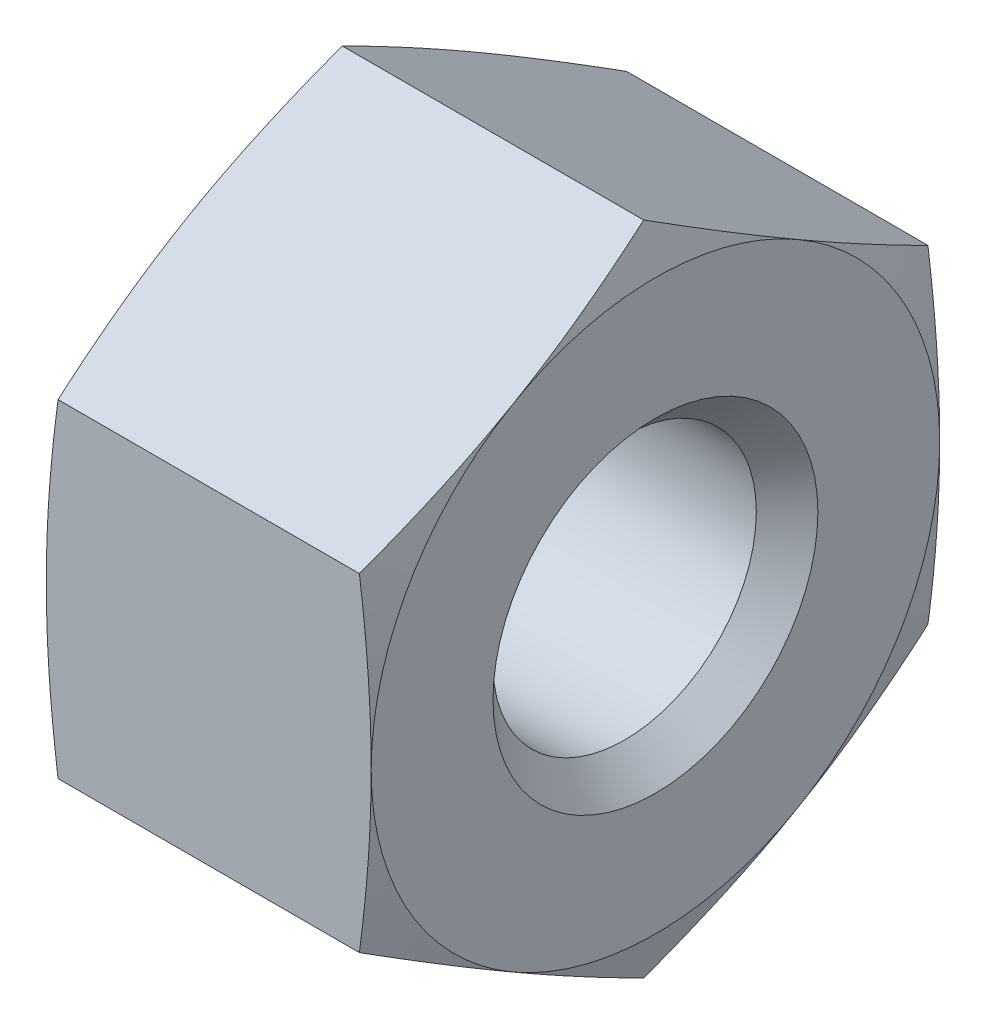
ISO-10303-21;
HEADER;
FILE_DESCRIPTION(('STEP AP214'),'2;1');
FILE_NAME('part.step','',(''),(''),'','','');
FILE_SCHEMA(('AUTOMOTIVE_DESIGN { 1 0 10303 214 1 1 1 1 }'));
ENDSEC;
DATA;
#1=APPLICATION_CONTEXT('core data for automotive mechanical design processes');
#2=APPLICATION_PROTOCOL_DEFINITION('international standard','automotive_design',2000,#1);
#3=PRODUCT_CONTEXT('',#1,'mechanical');
#4=PRODUCT('Part','Part','',(#3));
#5=PRODUCT_RELATED_PRODUCT_CATEGORY('part','',(#4));
#6=PRODUCT_DEFINITION_FORMATION('','',#4);
#7=PRODUCT_DEFINITION_CONTEXT('part definition',#1,'design');
#8=PRODUCT_DEFINITION('design','',#6,#7);
#9=PRODUCT_DEFINITION_SHAPE('','',#8);
#10=(LENGTH_UNIT() NAMED_UNIT(*) SI_UNIT(.MILLI.,.METRE.));
#11=(NAMED_UNIT(*) PLANE_ANGLE_UNIT() SI_UNIT($,.RADIAN.));
#12=(NAMED_UNIT(*) SI_UNIT($,.STERADIAN.) SOLID_ANGLE_UNIT());
#13=UNCERTAINTY_MEASURE_WITH_UNIT(LENGTH_MEASURE(1.E-05),#10,'distance_accuracy_value','');
#14=(GEOMETRIC_REPRESENTATION_CONTEXT(3) GLOBAL_UNCERTAINTY_ASSIGNED_CONTEXT((#13)) GLOBAL_UNIT_ASSIGNED_CONTEXT((#10,
#11,#12)) REPRESENTATION_CONTEXT('',''));
#15=CARTESIAN_POINT('',(0.,0.,0.));
#16=DIRECTION('',(0.,0.,1.));
#17=DIRECTION('',(1.,0.,0.));
#18=AXIS2_PLACEMENT_3D('',#15,#16,#17);
#19=CARTESIAN_POINT('',(4.,2.75,0.));
#20=DIRECTION('',(1.,0.,0.));
#21=DIRECTION('',(0.,0.,-1.));
#22=AXIS2_PLACEMENT_3D('',#19,#20,#21);
#23=PLANE('',#22);
#24=CARTESIAN_POINT('',(3.99999999996226,0.,0.));
#25=DIRECTION('',(1.,0.,0.));
#26=DIRECTION('',(0.,0.,-1.));
#27=AXIS2_PLACEMENT_3D('',#24,#25,#26);
#28=CIRCLE('',#27,2.00000000000955);
#29=CARTESIAN_POINT('',(3.99999999996226,0.,-2.00000000000955));
#30=VERTEX_POINT('',#29);
#31=EDGE_CURVE('E167',#30,#30,#28,.F.);
#32=ORIENTED_EDGE('',*,*,#31,.T.);
#33=EDGE_LOOP('',(#32));
#34=FACE_BOUND('',#33,.T.);
#35=CARTESIAN_POINT('',(3.99999999999999,0.,0.));
#36=DIRECTION('',(-1.,0.,0.));
#37=DIRECTION('',(0.,-1.,0.));
#38=AXIS2_PLACEMENT_3D('',#35,#36,#37);
#39=CIRCLE('',#38,3.5);
#40=CARTESIAN_POINT('',(3.99999999999999,0.,-3.5));
#41=VERTEX_POINT('',#40);
#42=CARTESIAN_POINT('',(3.99999999999999,-3.03108891324554,-1.75));
#43=VERTEX_POINT('',#42);
#44=EDGE_CURVE('E104',#41,#43,#39,.T.);
#45=ORIENTED_EDGE('',*,*,#44,.F.);
#46=CARTESIAN_POINT('',(3.99999999999999,0.,0.));
#47=DIRECTION('',(-1.,0.,0.));
#48=DIRECTION('',(0.,-1.,0.));
#49=AXIS2_PLACEMENT_3D('',#46,#47,#48);
#50=CIRCLE('',#49,3.49999999999999);
#51=CARTESIAN_POINT('',(3.99999999999999,3.03108891324553,-1.75));
#52=VERTEX_POINT('',#51);
#53=EDGE_CURVE('E18',#52,#41,#50,.T.);
#54=ORIENTED_EDGE('',*,*,#53,.F.);
#55=CARTESIAN_POINT('',(3.99999999999999,0.,0.));
#56=DIRECTION('',(-1.,0.,0.));
#57=DIRECTION('',(0.,-1.,0.));
#58=AXIS2_PLACEMENT_3D('',#55,#56,#57);
#59=CIRCLE('',#58,3.49999999999999);
#60=CARTESIAN_POINT('',(3.99999999999999,3.03108891324553,1.75));
#61=VERTEX_POINT('',#60);
#62=EDGE_CURVE('E454',#61,#52,#59,.T.);
#63=ORIENTED_EDGE('',*,*,#62,.F.);
#64=CARTESIAN_POINT('',(3.99999999999999,0.,0.));
#65=DIRECTION('',(-1.,0.,0.));
#66=DIRECTION('',(0.,-1.,0.));
#67=AXIS2_PLACEMENT_3D('',#64,#65,#66);
#68=CIRCLE('',#67,3.5);
#69=CARTESIAN_POINT('',(3.99999999999999,0.,3.5));
#70=VERTEX_POINT('',#69);
#71=EDGE_CURVE('E458',#70,#61,#68,.T.);
#72=ORIENTED_EDGE('',*,*,#71,.F.);
#73=CARTESIAN_POINT('',(3.99999999999999,0.,0.));
#74=DIRECTION('',(-1.,0.,0.));
#75=DIRECTION('',(0.,-1.,0.));
#76=AXIS2_PLACEMENT_3D('',#73,#74,#75);
#77=CIRCLE('',#76,3.5);
#78=CARTESIAN_POINT('',(3.99999999999999,-3.03108891324554,1.75));
#79=VERTEX_POINT('',#78);
#80=EDGE_CURVE('E448',#79,#70,#77,.T.);
#81=ORIENTED_EDGE('',*,*,#80,.F.);
#82=CARTESIAN_POINT('',(3.99999999999999,0.,0.));
#83=DIRECTION('',(-1.,0.,0.));
#84=DIRECTION('',(0.,-1.,0.));
#85=AXIS2_PLACEMENT_3D('',#82,#83,#84);
#86=CIRCLE('',#85,3.5);
#87=EDGE_CURVE('E107',#43,#79,#86,.T.);
#88=ORIENTED_EDGE('',*,*,#87,.F.);
#89=EDGE_LOOP('',(#45,#54,#63,#72,#81,#88));
#90=FACE_BOUND('',#89,.T.);
#91=ADVANCED_FACE('F15',(#34,#90),#23,.T.);
#92=CARTESIAN_POINT('',(3.85404791528328,0.,0.));
#93=DIRECTION('',(-1.,0.,0.));
#94=DIRECTION('',(0.,-1.,0.));
#95=AXIS2_PLACEMENT_3D('',#92,#93,#94);
#96=CONICAL_SURFACE('',#95,4.04470059563334,1.30899693899575);
#97=CARTESIAN_POINT('',(3.85491840485416,2.02072594216369,-3.5));
#98=CARTESIAN_POINT('',(3.87736917683996,2.10448512383601,-3.35492484174316));
#99=CARTESIAN_POINT('',(3.89775556926771,2.18839464686139,-3.20958928462431));
#100=CARTESIAN_POINT('',(3.93355670405657,2.35637986696115,-2.9186303484909));
#101=CARTESIAN_POINT('',(3.94897707691382,2.44045526632385,-2.77300748512805));
#102=CARTESIAN_POINT('',(3.97406106263086,2.60884836453657,-2.48134208337968));
#103=CARTESIAN_POINT('',(3.98372331729823,2.69316611584225,-2.3352994541383));
#104=CARTESIAN_POINT('',(3.99345415347838,2.81977878595144,-2.11599987662721));
#105=CARTESIAN_POINT('',(3.99590404464308,2.86203034378168,-2.04281803176631));
#106=CARTESIAN_POINT('',(3.99917891629725,2.94655050834606,-1.89642481247673));
#107=CARTESIAN_POINT('',(4.00000384450534,2.98881911558498,-1.82321343717374));
#108=CARTESIAN_POINT('',(3.99999999999999,3.03108891324553,-1.75));
#109=B_SPLINE_CURVE_WITH_KNOTS('',3,(#97,#98,#99,#100,#101,#102,#103,#104,#105,#106,#107,#108),
.UNSPECIFIED.,.F.,.F.,(4,2,2,2,2,4),(0.,0.5070702590149,1.01356355859227,1.52017627971381,
1.77377837155654,2.02738862263201),.UNSPECIFIED.);
#110=CARTESIAN_POINT('',(3.85491840485416,2.02072594216369,-3.5));
#111=VERTEX_POINT('',#110);
#112=EDGE_CURVE('E126',#111,#52,#109,.T.);
#113=ORIENTED_EDGE('',*,*,#112,.T.);
#114=ORIENTED_EDGE('',*,*,#53,.T.);
#115=CARTESIAN_POINT('',(3.99999999999999,0.,-3.5));
#116=CARTESIAN_POINT('',(4.00000384450534,0.0845395953211098,-3.5));
#117=CARTESIAN_POINT('',(3.99917891629725,0.169076809798954,-3.5));
#118=CARTESIAN_POINT('',(3.99590404464308,0.338117138927704,-3.5));
#119=CARTESIAN_POINT('',(3.99345415347838,0.422620254588179,-3.5));
#120=CARTESIAN_POINT('',(3.98372331729823,0.675845594806578,-3.5));
#121=CARTESIAN_POINT('',(3.97406106263086,0.844481097417921,-3.5));
#122=CARTESIAN_POINT('',(3.94897707691382,1.18126729384336,-3.5));
#123=CARTESIAN_POINT('',(3.93355670405657,1.34941809256878,-3.5));
#124=CARTESIAN_POINT('',(3.89775556926771,1.68538853276828,-3.5));
#125=CARTESIAN_POINT('',(3.87736917683996,1.85320757881906,-3.5));
#126=CARTESIAN_POINT('',(3.85491840485416,2.02072594216369,-3.5));
#127=B_SPLINE_CURVE_WITH_KNOTS('',3,(#115,#116,#117,#118,#119,#120,#121,#122,#123,#124,#125,
#126),.UNSPECIFIED.,.F.,.F.,(4,2,2,2,2,4),(0.,0.253610251075474,0.507212342918203,
1.01382506403975,1.52031836361711,2.02738862263201),.UNSPECIFIED.);
#128=EDGE_CURVE('E120',#41,#111,#127,.T.);
#129=ORIENTED_EDGE('',*,*,#128,.T.);
#130=EDGE_LOOP('',(#113,#114,#129));
#131=FACE_BOUND('',#130,.T.);
#132=ADVANCED_FACE('F124',(#131),#96,.T.);
#133=CARTESIAN_POINT('',(3.85404791528328,0.,0.));
#134=DIRECTION('',(-1.,0.,0.));
#135=DIRECTION('',(0.,-1.,0.));
#136=AXIS2_PLACEMENT_3D('',#133,#134,#135);
#137=CONICAL_SURFACE('',#136,4.04470059563334,1.30899693899575);
#138=ORIENTED_EDGE('',*,*,#44,.T.);
#139=CARTESIAN_POINT('',(3.99999999999999,-3.03108891324554,-1.75));
#140=CARTESIAN_POINT('',(4.00000384450534,-2.98881911558498,-1.82321343717374));
#141=CARTESIAN_POINT('',(3.99917891629725,-2.94655050834606,-1.89642481247672));
#142=CARTESIAN_POINT('',(3.99590404464308,-2.86203034378168,-2.0428180317663));
#143=CARTESIAN_POINT('',(3.99345415347838,-2.81977878595145,-2.11599987662721));
#144=CARTESIAN_POINT('',(3.98372331729823,-2.69316611584225,-2.3352994541383));
#145=CARTESIAN_POINT('',(3.97406106263086,-2.60884836453657,-2.48134208337968));
#146=CARTESIAN_POINT('',(3.94897707691382,-2.44045526632385,-2.77300748512805));
#147=CARTESIAN_POINT('',(3.93355670405657,-2.35637986696115,-2.9186303484909));
#148=CARTESIAN_POINT('',(3.89775556926771,-2.18839464686139,-3.20958928462431));
#149=CARTESIAN_POINT('',(3.87736917683996,-2.10448512383601,-3.35492484174316));
#150=CARTESIAN_POINT('',(3.85491840485416,-2.02072594216369,-3.5));
#151=B_SPLINE_CURVE_WITH_KNOTS('',3,(#139,#140,#141,#142,#143,#144,#145,#146,#147,#148,#149,
#150),.UNSPECIFIED.,.F.,.F.,(4,2,2,2,2,4),(0.,0.253610251075475,0.507212342918203,
1.01382506403975,1.52031836361711,2.02738862263202),.UNSPECIFIED.);
#152=CARTESIAN_POINT('',(3.85491840485416,-2.02072594216369,-3.5));
#153=VERTEX_POINT('',#152);
#154=EDGE_CURVE('E115',#43,#153,#151,.T.);
#155=ORIENTED_EDGE('',*,*,#154,.T.);
#156=CARTESIAN_POINT('',(3.85491840485416,-2.02072594216369,-3.5));
#157=CARTESIAN_POINT('',(3.87736917683996,-1.85320757881906,-3.5));
#158=CARTESIAN_POINT('',(3.89775556926771,-1.68538853276828,-3.5));
#159=CARTESIAN_POINT('',(3.93355670405657,-1.34941809256878,-3.5));
#160=CARTESIAN_POINT('',(3.94897707691382,-1.18126729384336,-3.5));
#161=CARTESIAN_POINT('',(3.97406106263086,-0.84448109741792,-3.5));
#162=CARTESIAN_POINT('',(3.98372331729823,-0.675845594806578,-3.5));
#163=CARTESIAN_POINT('',(3.99345415347838,-0.422620254588179,-3.5));
#164=CARTESIAN_POINT('',(3.99590404464308,-0.338117138927704,-3.5));
#165=CARTESIAN_POINT('',(3.99917891629725,-0.169076809798954,-3.5));
#166=CARTESIAN_POINT('',(4.00000384450534,-0.0845395953211098,-3.5));
#167=CARTESIAN_POINT('',(3.99999999999999,0.,-3.5));
#168=B_SPLINE_CURVE_WITH_KNOTS('',3,(#156,#157,#158,#159,#160,#161,#162,#163,#164,#165,#166,
#167),.UNSPECIFIED.,.F.,.F.,(4,2,2,2,2,4),(0.,0.507070259014901,1.01356355859227,
1.52017627971381,1.77377837155654,2.02738862263201),.UNSPECIFIED.);
#169=EDGE_CURVE('E113',#153,#41,#168,.T.);
#170=ORIENTED_EDGE('',*,*,#169,.T.);
#171=EDGE_LOOP('',(#138,#155,#170));
#172=FACE_BOUND('',#171,.T.);
#173=ADVANCED_FACE('F114',(#172),#137,.T.);
#174=CARTESIAN_POINT('',(3.85404791528328,0.,0.));
#175=DIRECTION('',(-1.,0.,0.));
#176=DIRECTION('',(0.,-1.,0.));
#177=AXIS2_PLACEMENT_3D('',#174,#175,#176);
#178=CONICAL_SURFACE('',#177,4.04470059563334,1.30899693899575);
#179=ORIENTED_EDGE('',*,*,#87,.T.);
#180=CARTESIAN_POINT('',(3.99999999999999,-3.03108891324554,1.75));
#181=CARTESIAN_POINT('',(4.00000384450534,-3.07335871090609,1.67678656282626));
#182=CARTESIAN_POINT('',(3.99917891629725,-3.11562731814501,1.60357518752327));
#183=CARTESIAN_POINT('',(3.99590404464308,-3.20014748270939,1.45718196823369));
#184=CARTESIAN_POINT('',(3.99345415347838,-3.24239904053963,1.38400012337279));
#185=CARTESIAN_POINT('',(3.98372331729823,-3.36901171064883,1.1647005458617));
#186=CARTESIAN_POINT('',(3.97406106263086,-3.4533294619545,1.01865791662032));
#187=CARTESIAN_POINT('',(3.94897707691382,-3.62172256016722,0.72699251487195));
#188=CARTESIAN_POINT('',(3.93355670405657,-3.70579795952992,0.581369651509097));
#189=CARTESIAN_POINT('',(3.89775556926771,-3.87378317962968,0.290410715375687));
#190=CARTESIAN_POINT('',(3.87736917683996,-3.95769270265506,0.145075158256844));
#191=CARTESIAN_POINT('',(3.85491840485416,-4.04145188432738,0.));
#192=B_SPLINE_CURVE_WITH_KNOTS('',3,(#180,#181,#182,#183,#184,#185,#186,#187,#188,#189,#190,
#191),.UNSPECIFIED.,.F.,.F.,(4,2,2,2,2,4),(0.,0.253610251075474,0.507212342918202,
1.01382506403974,1.52031836361711,2.02738862263201),.UNSPECIFIED.);
#193=CARTESIAN_POINT('',(3.85491840485416,-4.04145188432738,0.));
#194=VERTEX_POINT('',#193);
#195=EDGE_CURVE('E279',#79,#194,#192,.T.);
#196=ORIENTED_EDGE('',*,*,#195,.T.);
#197=CARTESIAN_POINT('',(3.85491840485416,-4.04145188432738,0.));
#198=CARTESIAN_POINT('',(3.87736917683996,-3.95769270265506,-0.145075158256844));
#199=CARTESIAN_POINT('',(3.89775556926771,-3.87378317962968,-0.290410715375686));
#200=CARTESIAN_POINT('',(3.93355670405657,-3.70579795952992,-0.581369651509097));
#201=CARTESIAN_POINT('',(3.94897707691382,-3.62172256016722,-0.72699251487195));
#202=CARTESIAN_POINT('',(3.97406106263086,-3.4533294619545,-1.01865791662032));
#203=CARTESIAN_POINT('',(3.98372331729823,-3.36901171064882,-1.1647005458617));
#204=CARTESIAN_POINT('',(3.99345415347838,-3.24239904053962,-1.38400012337279));
#205=CARTESIAN_POINT('',(3.99590404464308,-3.20014748270939,-1.45718196823369));
#206=CARTESIAN_POINT('',(3.99917891629725,-3.11562731814501,-1.60357518752327));
#207=CARTESIAN_POINT('',(4.00000384450534,-3.07335871090609,-1.67678656282626));
#208=CARTESIAN_POINT('',(3.99999999999999,-3.03108891324554,-1.75));
#209=B_SPLINE_CURVE_WITH_KNOTS('',3,(#197,#198,#199,#200,#201,#202,#203,#204,#205,#206,#207,
#208),.UNSPECIFIED.,.F.,.F.,(4,2,2,2,2,4),(0.,0.5070702590149,1.01356355859227,1.52017627971381,
1.77377837155654,2.02738862263201),.UNSPECIFIED.);
#210=EDGE_CURVE('E137',#194,#43,#209,.T.);
#211=ORIENTED_EDGE('',*,*,#210,.T.);
#212=EDGE_LOOP('',(#179,#196,#211));
#213=FACE_BOUND('',#212,.T.);
#214=ADVANCED_FACE('F267',(#213),#178,.T.);
#215=CARTESIAN_POINT('',(3.85404791528328,0.,0.));
#216=DIRECTION('',(-1.,0.,0.));
#217=DIRECTION('',(0.,-1.,0.));
#218=AXIS2_PLACEMENT_3D('',#215,#216,#217);
#219=CONICAL_SURFACE('',#218,4.04470059563334,1.30899693899575);
#220=ORIENTED_EDGE('',*,*,#80,.T.);
#221=CARTESIAN_POINT('',(3.99999999999999,0.,3.5));
#222=CARTESIAN_POINT('',(4.00000384450534,-0.0845395953211107,3.5));
#223=CARTESIAN_POINT('',(3.99917891629725,-0.169076809798955,3.5));
#224=CARTESIAN_POINT('',(3.99590404464308,-0.338117138927704,3.5));
#225=CARTESIAN_POINT('',(3.99345415347838,-0.42262025458818,3.5));
#226=CARTESIAN_POINT('',(3.98372331729823,-0.675845594806579,3.5));
#227=CARTESIAN_POINT('',(3.97406106263086,-0.844481097417921,3.5));
#228=CARTESIAN_POINT('',(3.94897707691382,-1.18126729384336,3.5));
#229=CARTESIAN_POINT('',(3.93355670405657,-1.34941809256878,3.5));
#230=CARTESIAN_POINT('',(3.89775556926771,-1.68538853276828,3.5));
#231=CARTESIAN_POINT('',(3.87736917683996,-1.85320757881906,3.5));
#232=CARTESIAN_POINT('',(3.85491840485416,-2.02072594216369,3.5));
#233=B_SPLINE_CURVE_WITH_KNOTS('',3,(#221,#222,#223,#224,#225,#226,#227,#228,#229,#230,#231,
#232),.UNSPECIFIED.,.F.,.F.,(4,2,2,2,2,4),(0.,0.253610251075474,0.507212342918202,
1.01382506403975,1.52031836361711,2.02738862263201),.UNSPECIFIED.);
#234=CARTESIAN_POINT('',(3.85491840485416,-2.02072594216369,3.5));
#235=VERTEX_POINT('',#234);
#236=EDGE_CURVE('E251',#70,#235,#233,.T.);
#237=ORIENTED_EDGE('',*,*,#236,.T.);
#238=CARTESIAN_POINT('',(3.85491840485416,-2.02072594216369,3.5));
#239=CARTESIAN_POINT('',(3.87736917683996,-2.10448512383601,3.35492484174316));
#240=CARTESIAN_POINT('',(3.89775556926771,-2.1883946468614,3.20958928462431));
#241=CARTESIAN_POINT('',(3.93355670405657,-2.35637986696115,2.9186303484909));
#242=CARTESIAN_POINT('',(3.94897707691382,-2.44045526632385,2.77300748512805));
#243=CARTESIAN_POINT('',(3.97406106263086,-2.60884836453658,2.48134208337968));
#244=CARTESIAN_POINT('',(3.98372331729823,-2.69316611584225,2.3352994541383));
#245=CARTESIAN_POINT('',(3.99345415347838,-2.81977878595145,2.11599987662721));
#246=CARTESIAN_POINT('',(3.99590404464308,-2.86203034378168,2.0428180317663));
#247=CARTESIAN_POINT('',(3.99917891629725,-2.94655050834606,1.89642481247672));
#248=CARTESIAN_POINT('',(4.00000384450534,-2.98881911558498,1.82321343717374));
#249=CARTESIAN_POINT('',(3.99999999999999,-3.03108891324554,1.75));
#250=B_SPLINE_CURVE_WITH_KNOTS('',3,(#238,#239,#240,#241,#242,#243,#244,#245,#246,#247,#248,
#249),.UNSPECIFIED.,.F.,.F.,(4,2,2,2,2,4),(0.,0.507070259014902,1.01356355859227,
1.52017627971381,1.77377837155654,2.02738862263202),.UNSPECIFIED.);
#251=EDGE_CURVE('E272',#235,#79,#250,.T.);
#252=ORIENTED_EDGE('',*,*,#251,.T.);
#253=EDGE_LOOP('',(#220,#237,#252));
#254=FACE_BOUND('',#253,.T.);
#255=ADVANCED_FACE('F261',(#254),#219,.T.);
#256=CARTESIAN_POINT('',(3.85404791528328,0.,0.));
#257=DIRECTION('',(-1.,0.,0.));
#258=DIRECTION('',(0.,-1.,0.));
#259=AXIS2_PLACEMENT_3D('',#256,#257,#258);
#260=CONICAL_SURFACE('',#259,4.04470059563334,1.30899693899575);
#261=CARTESIAN_POINT('',(3.99999999999999,3.03108891324553,-1.75));
#262=CARTESIAN_POINT('',(4.00000384450534,3.07335871090609,-1.67678656282627));
#263=CARTESIAN_POINT('',(3.99917891629725,3.11562731814501,-1.60357518752328));
#264=CARTESIAN_POINT('',(3.99590404464308,3.20014748270939,-1.4571819682337));
#265=CARTESIAN_POINT('',(3.99345415347838,3.24239904053962,-1.38400012337279));
#266=CARTESIAN_POINT('',(3.98372331729823,3.36901171064882,-1.1647005458617));
#267=CARTESIAN_POINT('',(3.97406106263086,3.4533294619545,-1.01865791662032));
#268=CARTESIAN_POINT('',(3.94897707691382,3.62172256016722,-0.726992514871952));
#269=CARTESIAN_POINT('',(3.93355670405657,3.70579795952992,-0.581369651509099));
#270=CARTESIAN_POINT('',(3.89775556926771,3.87378317962968,-0.290410715375688));
#271=CARTESIAN_POINT('',(3.87736917683996,3.95769270265506,-0.145075158256845));
#272=CARTESIAN_POINT('',(3.85491840485416,4.04145188432738,0.));
#273=B_SPLINE_CURVE_WITH_KNOTS('',3,(#261,#262,#263,#264,#265,#266,#267,#268,#269,#270,#271,
#272),.UNSPECIFIED.,.F.,.F.,(4,2,2,2,2,4),(0.,0.253610251075475,0.507212342918203,
1.01382506403975,1.52031836361711,2.02738862263201),.UNSPECIFIED.);
#274=CARTESIAN_POINT('',(3.85491840485416,4.04145188432738,0.));
#275=VERTEX_POINT('',#274);
#276=EDGE_CURVE('E121',#52,#275,#273,.T.);
#277=ORIENTED_EDGE('',*,*,#276,.T.);
#278=CARTESIAN_POINT('',(3.85491840485416,4.04145188432738,0.));
#279=CARTESIAN_POINT('',(3.87736917683996,3.95769270265506,0.145075158256844));
#280=CARTESIAN_POINT('',(3.89775556926771,3.87378317962967,0.290410715375687));
#281=CARTESIAN_POINT('',(3.93355670405657,3.70579795952992,0.581369651509098));
#282=CARTESIAN_POINT('',(3.94897707691382,3.62172256016721,0.726992514871952));
#283=CARTESIAN_POINT('',(3.97406106263086,3.45332946195449,1.01865791662032));
#284=CARTESIAN_POINT('',(3.98372331729823,3.36901171064882,1.1647005458617));
#285=CARTESIAN_POINT('',(3.99345415347838,3.24239904053962,1.38400012337279));
#286=CARTESIAN_POINT('',(3.99590404464308,3.20014748270939,1.4571819682337));
#287=CARTESIAN_POINT('',(3.99917891629725,3.11562731814501,1.60357518752328));
#288=CARTESIAN_POINT('',(4.00000384450534,3.07335871090609,1.67678656282627));
#289=CARTESIAN_POINT('',(3.99999999999999,3.03108891324553,1.75));
#290=B_SPLINE_CURVE_WITH_KNOTS('',3,(#278,#279,#280,#281,#282,#283,#284,#285,#286,#287,#288,
#289),.UNSPECIFIED.,.F.,.F.,(4,2,2,2,2,4),(0.,0.507070259014902,1.01356355859227,
1.52017627971381,1.77377837155654,2.02738862263202),.UNSPECIFIED.);
#291=EDGE_CURVE('E243',#275,#61,#290,.T.);
#292=ORIENTED_EDGE('',*,*,#291,.T.);
#293=ORIENTED_EDGE('',*,*,#62,.T.);
#294=EDGE_LOOP('',(#277,#292,#293));
#295=FACE_BOUND('',#294,.T.);
#296=ADVANCED_FACE('F257',(#295),#260,.T.);
#297=CARTESIAN_POINT('',(3.85404791528328,0.,0.));
#298=DIRECTION('',(-1.,0.,0.));
#299=DIRECTION('',(0.,-1.,0.));
#300=AXIS2_PLACEMENT_3D('',#297,#298,#299);
#301=CONICAL_SURFACE('',#300,4.04470059563334,1.30899693899575);
#302=CARTESIAN_POINT('',(3.85491840485416,2.02072594216369,3.5));
#303=CARTESIAN_POINT('',(3.87736917683996,1.85320757881906,3.5));
#304=CARTESIAN_POINT('',(3.89775556926771,1.68538853276828,3.5));
#305=CARTESIAN_POINT('',(3.93355670405657,1.34941809256878,3.5));
#306=CARTESIAN_POINT('',(3.94897707691382,1.18126729384336,3.5));
#307=CARTESIAN_POINT('',(3.97406106263086,0.844481097417921,3.5));
#308=CARTESIAN_POINT('',(3.98372331729823,0.675845594806579,3.5));
#309=CARTESIAN_POINT('',(3.99345415347838,0.422620254588179,3.5));
#310=CARTESIAN_POINT('',(3.99590404464308,0.338117138927703,3.5));
#311=CARTESIAN_POINT('',(3.99917891629725,0.169076809798954,3.5));
#312=CARTESIAN_POINT('',(4.00000384450534,0.0845395953211095,3.5));
#313=CARTESIAN_POINT('',(3.99999999999999,0.,3.5));
#314=B_SPLINE_CURVE_WITH_KNOTS('',3,(#302,#303,#304,#305,#306,#307,#308,#309,#310,#311,#312,
#313),.UNSPECIFIED.,.F.,.F.,(4,2,2,2,2,4),(0.,0.507070259014901,1.01356355859227,
1.52017627971381,1.77377837155654,2.02738862263201),.UNSPECIFIED.);
#315=CARTESIAN_POINT('',(3.85491840485416,2.02072594216369,3.5));
#316=VERTEX_POINT('',#315);
#317=EDGE_CURVE('E379',#316,#70,#314,.T.);
#318=ORIENTED_EDGE('',*,*,#317,.T.);
#319=ORIENTED_EDGE('',*,*,#71,.T.);
#320=CARTESIAN_POINT('',(3.99999999999999,3.03108891324553,1.75));
#321=CARTESIAN_POINT('',(4.00000384450534,2.98881911558498,1.82321343717374));
#322=CARTESIAN_POINT('',(3.99917891629725,2.94655050834606,1.89642481247673));
#323=CARTESIAN_POINT('',(3.99590404464308,2.86203034378168,2.04281803176631));
#324=CARTESIAN_POINT('',(3.99345415347838,2.81977878595144,2.11599987662721));
#325=CARTESIAN_POINT('',(3.98372331729823,2.69316611584224,2.3352994541383));
#326=CARTESIAN_POINT('',(3.97406106263086,2.60884836453657,2.48134208337968));
#327=CARTESIAN_POINT('',(3.94897707691382,2.44045526632385,2.77300748512805));
#328=CARTESIAN_POINT('',(3.93355670405657,2.35637986696115,2.9186303484909));
#329=CARTESIAN_POINT('',(3.89775556926771,2.18839464686139,3.20958928462431));
#330=CARTESIAN_POINT('',(3.87736917683996,2.10448512383601,3.35492484174316));
#331=CARTESIAN_POINT('',(3.85491840485416,2.02072594216369,3.5));
#332=B_SPLINE_CURVE_WITH_KNOTS('',3,(#320,#321,#322,#323,#324,#325,#326,#327,#328,#329,#330,
#331),.UNSPECIFIED.,.F.,.F.,(4,2,2,2,2,4),(0.,0.253610251075474,0.507212342918202,
1.01382506403974,1.52031836361711,2.02738862263201),.UNSPECIFIED.);
#333=EDGE_CURVE('E207',#61,#316,#332,.T.);
#334=ORIENTED_EDGE('',*,*,#333,.T.);
#335=EDGE_LOOP('',(#318,#319,#334));
#336=FACE_BOUND('',#335,.T.);
#337=ADVANCED_FACE('F260',(#336),#301,.T.);
#338=CARTESIAN_POINT('',(4.0000000000191,0.,0.));
#339=DIRECTION('',(1.,0.,0.));
#340=DIRECTION('',(0.,0.,-1.));
#341=AXIS2_PLACEMENT_3D('',#338,#339,#340);
#342=CONICAL_SURFACE('',#341,2.00000000006639,0.785398163397448);
#343=CARTESIAN_POINT('',(3.621,0.,0.));
#344=DIRECTION('',(1.,0.,0.));
#345=DIRECTION('',(0.,1.,0.));
#346=AXIS2_PLACEMENT_3D('',#343,#344,#345);
#347=CIRCLE('',#346,1.621);
#348=CARTESIAN_POINT('',(3.621,1.621,0.));
#349=VERTEX_POINT('',#348);
#350=EDGE_CURVE('E202',#349,#349,#347,.F.);
#351=ORIENTED_EDGE('',*,*,#350,.T.);
#352=EDGE_LOOP('',(#351));
#353=FACE_BOUND('',#352,.T.);
#354=ORIENTED_EDGE('',*,*,#31,.F.);
#355=EDGE_LOOP('',(#354));
#356=FACE_BOUND('',#355,.T.);
#357=ADVANCED_FACE('F177',(#353,#356),#342,.F.);
#358=CARTESIAN_POINT('',(5.,4.04145188432738,0.));
#359=DIRECTION('',(0.,-0.866025403784439,0.5));
#360=DIRECTION('',(0.,-0.5,-0.866025403784439));
#361=AXIS2_PLACEMENT_3D('',#358,#359,#360);
#362=PLANE('',#361);
#363=CARTESIAN_POINT('',(0.145081608245902,4.04145185238628,-1.34823072870567E-08));
#364=CARTESIAN_POINT('',(0.122630826132476,3.95769268398321,-0.145075175601402));
#365=CARTESIAN_POINT('',(0.102244429817869,3.87378316698493,-0.290410733266092));
#366=CARTESIAN_POINT('',(0.0664432926892216,3.70579795260836,-0.58136966750397));
#367=CARTESIAN_POINT('',(0.0510229213706809,3.6217225529491,-0.726992528428568));
#368=CARTESIAN_POINT('',(0.0259389371152439,3.45332945595195,-1.01865792596233));
#369=CARTESIAN_POINT('',(0.0162766823657995,3.36901170615899,-1.16470055342723));
#370=CARTESIAN_POINT('',(0.00654584631208415,3.24239903787159,-1.38400012809963));
#371=CARTESIAN_POINT('',(0.00409595523122862,3.20014748056529,-1.45718197200021));
#372=CARTESIAN_POINT('',(0.000821083702638755,3.11562731704075,-1.60357518938307));
#373=CARTESIAN_POINT('',(-3.84446338335835E-06,3.07335871031773,-1.67678656373966));
#374=CARTESIAN_POINT('',(0.,3.03108891324554,-1.75));
#375=B_SPLINE_CURVE_WITH_KNOTS('',3,(#363,#364,#365,#366,#367,#368,#369,#370,#371,#372,#373,
#374),.UNSPECIFIED.,.F.,.F.,(4,2,2,2,2,4),(0.,0.507070252846175,1.01356354603767,
1.52017626036794,1.77377834891865,2.02738859675396),.UNSPECIFIED.);
#376=CARTESIAN_POINT('',(0.145081593442021,4.04145187796864,-1.10136614676012E-08));
#377=VERTEX_POINT('',#376);
#378=CARTESIAN_POINT('',(0.,3.03108891324554,-1.75));
#379=VERTEX_POINT('',#378);
#380=EDGE_CURVE('E192',#377,#379,#375,.T.);
#381=ORIENTED_EDGE('',*,*,#380,.F.);
#382=DIRECTION('',(1.,0.,0.));
#383=VECTOR('',#382,1.);
#384=CARTESIAN_POINT('',(5.,4.04145188432738,0.));
#385=LINE('',#384,#383);
#386=EDGE_CURVE('E250',#377,#275,#385,.T.);
#387=ORIENTED_EDGE('',*,*,#386,.T.);
#388=ORIENTED_EDGE('',*,*,#276,.F.);
#389=ORIENTED_EDGE('',*,*,#112,.F.);
#390=DIRECTION('',(1.,0.,0.));
#391=VECTOR('',#390,1.);
#392=CARTESIAN_POINT('',(5.,2.02072594216369,-3.5));
#393=LINE('',#392,#391);
#394=CARTESIAN_POINT('',(0.145081588672685,2.0207258938474,-3.5));
#395=VERTEX_POINT('',#394);
#396=EDGE_CURVE('E132',#111,#395,#393,.F.);
#397=ORIENTED_EDGE('',*,*,#396,.T.);
#398=CARTESIAN_POINT('',(0.,3.03108891324554,-1.75));
#399=CARTESIAN_POINT('',(-3.84450565334801E-06,2.98881911471421,-1.82321343868196));
#400=CARTESIAN_POINT('',(0.000821083736592939,2.94655050660459,-1.89642481549303));
#401=CARTESIAN_POINT('',(0.00409595552535838,2.86203034029992,-2.04281803779689));
#402=CARTESIAN_POINT('',(0.00654584679049037,2.81977878160009,-2.11599988416398));
#403=CARTESIAN_POINT('',(0.0162766833668347,2.69316610888978,-2.33529946618033));
#404=CARTESIAN_POINT('',(0.0259389384248859,2.60884835585523,-2.48134209841621));
#405=CARTESIAN_POINT('',(0.0510229251300052,2.44045525419889,-2.77300750612911));
#406=CARTESIAN_POINT('',(0.0664432985845038,2.35637985312143,-2.91863037246199));
#407=CARTESIAN_POINT('',(0.102244434720915,2.18839462959976,-3.20958931452235));
#408=CARTESIAN_POINT('',(0.122630827899319,2.10448510486721,-3.35492487459807));
#409=CARTESIAN_POINT('',(0.145081600684255,2.02072592149405,-3.50000003580088));
#410=B_SPLINE_CURVE_WITH_KNOTS('',3,(#398,#399,#400,#401,#402,#403,#404,#405,#406,#407,#408,
#409),.UNSPECIFIED.,.F.,.F.,(4,2,2,2,2,4),(0.,0.253610256299576,0.507212353365564,
1.01382508490345,1.52031839488668,2.02738866433712),.UNSPECIFIED.);
#411=EDGE_CURVE('E183',#379,#395,#410,.T.);
#412=ORIENTED_EDGE('',*,*,#411,.F.);
#413=EDGE_LOOP('',(#381,#387,#388,#389,#397,#412));
#414=FACE_BOUND('',#413,.T.);
#415=ADVANCED_FACE('F173',(#414),#362,.F.);
#416=CARTESIAN_POINT('',(5.,2.02072594216369,-3.5));
#417=DIRECTION('',(0.,0.,1.));
#418=DIRECTION('',(1.,0.,0.));
#419=AXIS2_PLACEMENT_3D('',#416,#417,#418);
#420=PLANE('',#419);
#421=CARTESIAN_POINT('',(0.145081582199529,2.0207258455311,-3.5));
#422=CARTESIAN_POINT('',(0.122630812081759,1.85320749013812,-3.5));
#423=CARTESIAN_POINT('',(0.102244421408681,1.68538845206845,-3.5));
#424=CARTESIAN_POINT('',(0.0664432897697981,1.34941802786677,-3.5));
#425=CARTESIAN_POINT('',(0.0510229183086575,1.18126723715797,-3.5));
#426=CARTESIAN_POINT('',(0.025938934901282,0.844481056831788,-3.5));
#427=CARTESIAN_POINT('',(0.0162766811471495,0.675845562303122,-3.5));
#428=CARTESIAN_POINT('',(0.00654584589312435,0.422620234245178,-3.5));
#429=CARTESIAN_POINT('',(0.00409595496318598,0.338117122650146,-3.5));
#430=CARTESIAN_POINT('',(0.000821083623634316,0.169076801657425,-3.5));
#431=CARTESIAN_POINT('',(-3.84450461335725E-06,0.0845395912501672,-3.5));
#432=CARTESIAN_POINT('',(0.,0.,-3.5));
#433=B_SPLINE_CURVE_WITH_KNOTS('',3,(#421,#422,#423,#424,#425,#426,#427,#428,#429,#430,#431,
#432),.UNSPECIFIED.,.F.,.F.,(4,2,2,2,2,4),(0.,0.507070234621338,1.01356350987448,
1.52017620664733,1.77377828628044,2.02738852514432),.UNSPECIFIED.);
#434=CARTESIAN_POINT('',(0.,0.,-3.5));
#435=VERTEX_POINT('',#434);
#436=EDGE_CURVE('E346',#395,#435,#433,.T.);
#437=ORIENTED_EDGE('',*,*,#436,.F.);
#438=ORIENTED_EDGE('',*,*,#396,.F.);
#439=ORIENTED_EDGE('',*,*,#128,.F.);
#440=ORIENTED_EDGE('',*,*,#169,.F.);
#441=DIRECTION('',(1.,0.,0.));
#442=VECTOR('',#441,1.);
#443=CARTESIAN_POINT('',(5.,-2.02072594216369,-3.5));
#444=LINE('',#443,#442);
#445=CARTESIAN_POINT('',(0.145081588672685,-2.02072596632184,-3.49999995815686));
#446=VERTEX_POINT('',#445);
#447=EDGE_CURVE('E280',#153,#446,#444,.F.);
#448=ORIENTED_EDGE('',*,*,#447,.T.);
#449=CARTESIAN_POINT('',(0.,0.,-3.5));
#450=CARTESIAN_POINT('',(-3.84450565351428E-06,-0.0845395970626539,-3.5));
#451=CARTESIAN_POINT('',(0.000821083736592766,-0.169076813281889,-3.5));
#452=CARTESIAN_POINT('',(0.00409595552535824,-0.338117145891221,-3.5));
#453=CARTESIAN_POINT('',(0.00654584679049029,-0.422620263290888,-3.5));
#454=CARTESIAN_POINT('',(0.0162766833668347,-0.675845608711514,-3.5));
#455=CARTESIAN_POINT('',(0.0259389384248857,-0.844481114780614,-3.5));
#456=CARTESIAN_POINT('',(0.0510229251300048,-1.1812673180933,-3.5));
#457=CARTESIAN_POINT('',(0.0664432985845035,-1.34941812024821,-3.5));
#458=CARTESIAN_POINT('',(0.102244434720914,-1.68538856729156,-3.5));
#459=CARTESIAN_POINT('',(0.122630827899318,-1.85320761675664,-3.5));
#460=CARTESIAN_POINT('',(0.145081600684255,-2.02072598350298,-3.5));
#461=B_SPLINE_CURVE_WITH_KNOTS('',3,(#449,#450,#451,#452,#453,#454,#455,#456,#457,#458,#459,
#460),.UNSPECIFIED.,.F.,.F.,(4,2,2,2,2,4),(0.,0.253610256299576,0.507212353365563,
1.01382508490345,1.52031839488668,2.02738866433712),.UNSPECIFIED.);
#462=EDGE_CURVE('E329',#435,#446,#461,.T.);
#463=ORIENTED_EDGE('',*,*,#462,.F.);
#464=EDGE_LOOP('',(#437,#438,#439,#440,#448,#463));
#465=FACE_BOUND('',#464,.T.);
#466=ADVANCED_FACE('F131',(#465),#420,.F.);
#467=CARTESIAN_POINT('',(5.,-2.02072594216369,-3.5));
#468=DIRECTION('',(0.,0.866025403784439,0.5));
#469=DIRECTION('',(0.,-0.5,0.866025403784439));
#470=AXIS2_PLACEMENT_3D('',#467,#468,#469);
#471=PLANE('',#470);
#472=CARTESIAN_POINT('',(0.145081582199529,-2.02072599047998,-3.49999991631373));
#473=CARTESIAN_POINT('',(0.122630812081758,-2.10448516817648,-3.35492476494321));
#474=CARTESIAN_POINT('',(0.102244421408681,-2.18839468721131,-3.20958921473621));
#475=CARTESIAN_POINT('',(0.0664432897697979,-2.35637989931215,-2.91863029245732));
#476=CARTESIAN_POINT('',(0.0510229183086574,-2.44045529466655,-2.77300743603706));
#477=CARTESIAN_POINT('',(0.025938934901282,-2.60884838482964,-2.48134204823106));
#478=CARTESIAN_POINT('',(0.0162766811471496,-2.69316613209397,-2.33529942598948));
#479=CARTESIAN_POINT('',(0.00654584589312423,-2.81977879612295,-2.11599985900966));
#480=CARTESIAN_POINT('',(0.00409595496318578,-2.86203035192046,-2.04281801766953));
#481=CARTESIAN_POINT('',(0.00082108362363403,-2.94655051241682,-1.89642480542596));
#482=CARTESIAN_POINT('',(-3.84450461366118E-06,-2.98881911762045,-1.8232134336482));
#483=CARTESIAN_POINT('',(0.,-3.03108891324553,-1.75));
#484=B_SPLINE_CURVE_WITH_KNOTS('',3,(#472,#473,#474,#475,#476,#477,#478,#479,#480,#481,#482,
#483),.UNSPECIFIED.,.F.,.F.,(4,2,2,2,2,4),(0.,0.507070234621338,1.01356350987448,
1.52017620664733,1.77377828628044,2.02738852514432),.UNSPECIFIED.);
#485=CARTESIAN_POINT('',(0.,-3.03108891324554,-1.75));
#486=VERTEX_POINT('',#485);
#487=EDGE_CURVE('E333',#446,#486,#484,.T.);
#488=ORIENTED_EDGE('',*,*,#487,.F.);
#489=ORIENTED_EDGE('',*,*,#447,.F.);
#490=ORIENTED_EDGE('',*,*,#154,.F.);
#491=ORIENTED_EDGE('',*,*,#210,.F.);
#492=DIRECTION('',(1.,0.,0.));
#493=VECTOR('',#492,1.);
#494=CARTESIAN_POINT('',(5.,-4.04145188432738,0.));
#495=LINE('',#494,#493);
#496=CARTESIAN_POINT('',(0.145081598211357,-4.04145189576804,-1.9815813071072E-08));
#497=VERTEX_POINT('',#496);
#498=EDGE_CURVE('E376',#194,#497,#495,.F.);
#499=ORIENTED_EDGE('',*,*,#498,.T.);
#500=CARTESIAN_POINT('',(0.,-3.03108891324553,-1.75));
#501=CARTESIAN_POINT('',(-3.84450461361224E-06,-3.07335870887062,-1.6767865663518));
#502=CARTESIAN_POINT('',(0.000821083623634037,-3.11562731407425,-1.60357519457405));
#503=CARTESIAN_POINT('',(0.00409595496318561,-3.2001474745706,-1.45718198233048));
#504=CARTESIAN_POINT('',(0.00654584589312391,-3.24239903036812,-1.38400014099035));
#505=CARTESIAN_POINT('',(0.0162766811471488,-3.36901169439709,-1.16470057401053));
#506=CARTESIAN_POINT('',(0.025938934901281,-3.45332944166142,-1.01865795176895));
#507=CARTESIAN_POINT('',(0.0510229183086554,-3.62172253182451,-0.726992563962956));
#508=CARTESIAN_POINT('',(0.0664432897697954,-3.70579792717891,-0.581369707542695));
#509=CARTESIAN_POINT('',(0.102244421408678,-3.87378313927975,-0.290410785263813));
#510=CARTESIAN_POINT('',(0.122630812081754,-3.95769265831458,-0.145075235056814));
#511=CARTESIAN_POINT('',(0.145081582199524,-4.04145183601107,-8.36863010259169E-08));
#512=B_SPLINE_CURVE_WITH_KNOTS('',3,(#500,#501,#502,#503,#504,#505,#506,#507,#508,#509,#510,
#511),.UNSPECIFIED.,.F.,.F.,(4,2,2,2,2,4),(0.,0.253610238863881,0.507212318496987,
1.01382501526982,1.52031829052296,2.02738852514429),.UNSPECIFIED.);
#513=EDGE_CURVE('E312',#486,#497,#512,.T.);
#514=ORIENTED_EDGE('',*,*,#513,.F.);
#515=EDGE_LOOP('',(#488,#489,#490,#491,#499,#514));
#516=FACE_BOUND('',#515,.T.);
#517=ADVANCED_FACE('F290',(#516),#471,.F.);
#518=CARTESIAN_POINT('',(5.,-4.04145188432738,0.));
#519=DIRECTION('',(0.,0.866025403784439,-0.5));
#520=DIRECTION('',(0.,0.5,0.866025403784439));
#521=AXIS2_PLACEMENT_3D('',#518,#519,#520);
#522=PLANE('',#521);
#523=ORIENTED_EDGE('',*,*,#498,.F.);
#524=ORIENTED_EDGE('',*,*,#195,.F.);
#525=ORIENTED_EDGE('',*,*,#251,.F.);
#526=DIRECTION('',(-1.,0.,0.));
#527=VECTOR('',#526,1.);
#528=CARTESIAN_POINT('',(5.,-2.02072594216369,3.5));
#529=LINE('',#528,#527);
#530=CARTESIAN_POINT('',(0.145081598211357,-2.02072596504502,3.5));
#531=VERTEX_POINT('',#530);
#532=EDGE_CURVE('E368',#235,#531,#529,.T.);
#533=ORIENTED_EDGE('',*,*,#532,.T.);
#534=CARTESIAN_POINT('',(0.,-3.03108891324554,1.75));
#535=CARTESIAN_POINT('',(-3.84450461355125E-06,-2.98881911762045,1.8232134336482));
#536=CARTESIAN_POINT('',(0.0008210836236341,-2.94655051241682,1.89642480542595));
#537=CARTESIAN_POINT('',(0.00409595496318565,-2.86203035192047,2.04281801766952));
#538=CARTESIAN_POINT('',(0.00654584589312394,-2.81977879612295,2.11599985900965));
#539=CARTESIAN_POINT('',(0.0162766811471488,-2.69316613209398,2.33529942598947));
#540=CARTESIAN_POINT('',(0.0259389349012811,-2.60884838482965,2.48134204823105));
#541=CARTESIAN_POINT('',(0.0510229183086557,-2.44045529466656,2.77300743603704));
#542=CARTESIAN_POINT('',(0.0664432897697958,-2.35637989931216,2.9186302924573));
#543=CARTESIAN_POINT('',(0.102244421408678,-2.18839468721132,3.20958921473619));
#544=CARTESIAN_POINT('',(0.122630812081755,-2.10448516817649,3.35492476494319));
#545=CARTESIAN_POINT('',(0.145081582199525,-2.02072599048,3.4999999163137));
#546=B_SPLINE_CURVE_WITH_KNOTS('',3,(#534,#535,#536,#537,#538,#539,#540,#541,#542,#543,#544,
#545),.UNSPECIFIED.,.F.,.F.,(4,2,2,2,2,4),(0.,0.253610238863881,0.507212318496986,
1.01382501526982,1.52031829052296,2.02738852514429),.UNSPECIFIED.);
#547=CARTESIAN_POINT('',(0.,-3.03108891324554,1.75));
#548=VERTEX_POINT('',#547);
#549=EDGE_CURVE('E296',#548,#531,#546,.T.);
#550=ORIENTED_EDGE('',*,*,#549,.F.);
#551=CARTESIAN_POINT('',(0.145081634293269,-4.0414518687603,-5.67221693907132E-08));
#552=CARTESIAN_POINT('',(0.122630840183548,-3.95769270965141,0.145075116145846));
#553=CARTESIAN_POINT('',(0.102244438227149,-3.87378319468997,0.290410681268366));
#554=CARTESIAN_POINT('',(0.0664432956085461,-3.7057979780379,0.581369627465342));
#555=CARTESIAN_POINT('',(0.0510229244326758,-3.62172257407369,0.726992492894237));
#556=CARTESIAN_POINT('',(0.0259389393292286,-3.45332947024242,1.01865790015572));
#557=CARTESIAN_POINT('',(0.016276683584453,-3.36901171792087,1.16470053284395));
#558=CARTESIAN_POINT('',(0.00654584673104057,-3.24239904537506,1.38400011520892));
#559=CARTESIAN_POINT('',(0.00409595549926932,-3.20014748655997,1.45718196166996));
#560=CARTESIAN_POINT('',(0.000821083781643933,-3.11562732000726,1.60357518419209));
#561=CARTESIAN_POINT('',(-3.8444221513594E-06,-3.07335871176483,1.67678656112752));
#562=CARTESIAN_POINT('',(0.,-3.03108891324554,1.75));
#563=B_SPLINE_CURVE_WITH_KNOTS('',3,(#551,#552,#553,#554,#555,#556,#557,#558,#559,#560,#561,
#562),.UNSPECIFIED.,.F.,.F.,(4,2,2,2,2,4),(0.,0.507070271071027,1.01356358220088,
1.52017631408854,1.77377841155686,2.02738866836357),.UNSPECIFIED.);
#564=EDGE_CURVE('E304',#497,#548,#563,.T.);
#565=ORIENTED_EDGE('',*,*,#564,.F.);
#566=EDGE_LOOP('',(#523,#524,#525,#533,#550,#565));
#567=FACE_BOUND('',#566,.T.);
#568=ADVANCED_FACE('F287',(#567),#522,.F.);
#569=CARTESIAN_POINT('',(5.,-2.02072594216369,3.5));
#570=DIRECTION('',(0.,0.,-1.));
#571=DIRECTION('',(-1.,0.,0.));
#572=AXIS2_PLACEMENT_3D('',#569,#570,#571);
#573=PLANE('',#572);
#574=ORIENTED_EDGE('',*,*,#532,.F.);
#575=ORIENTED_EDGE('',*,*,#236,.F.);
#576=ORIENTED_EDGE('',*,*,#317,.F.);
#577=DIRECTION('',(1.,0.,0.));
#578=VECTOR('',#577,1.);
#579=CARTESIAN_POINT('',(5.,2.02072594216369,3.5));
#580=LINE('',#579,#578);
#581=CARTESIAN_POINT('',(0.145081598211358,2.02072593072302,3.50000001981581));
#582=VERTEX_POINT('',#581);
#583=EDGE_CURVE('E373',#316,#582,#580,.F.);
#584=ORIENTED_EDGE('',*,*,#583,.T.);
#585=CARTESIAN_POINT('',(0.,0.,3.5));
#586=CARTESIAN_POINT('',(-3.84450461343019E-06,0.0845395912501669,3.5));
#587=CARTESIAN_POINT('',(0.000821083623634206,0.169076801657423,3.5));
#588=CARTESIAN_POINT('',(0.00409595496318578,0.338117122650141,3.5));
#589=CARTESIAN_POINT('',(0.0065458458931241,0.422620234245171,3.5));
#590=CARTESIAN_POINT('',(0.0162766811471491,0.675845562303112,3.5));
#591=CARTESIAN_POINT('',(0.0259389349012813,0.844481056831774,3.5));
#592=CARTESIAN_POINT('',(0.0510229183086559,1.18126723715795,3.5));
#593=CARTESIAN_POINT('',(0.066443289769796,1.34941802786675,3.5));
#594=CARTESIAN_POINT('',(0.102244421408678,1.68538845206842,3.5));
#595=CARTESIAN_POINT('',(0.122630812081755,1.85320749013809,3.5));
#596=CARTESIAN_POINT('',(0.145081582199525,2.02072584553107,3.5));
#597=B_SPLINE_CURVE_WITH_KNOTS('',3,(#585,#586,#587,#588,#589,#590,#591,#592,#593,#594,#595,
#596),.UNSPECIFIED.,.F.,.F.,(4,2,2,2,2,4),(0.,0.253610238863881,0.507212318496986,
1.01382501526982,1.52031829052296,2.02738852514429),.UNSPECIFIED.);
#598=CARTESIAN_POINT('',(0.,0.,3.5));
#599=VERTEX_POINT('',#598);
#600=EDGE_CURVE('E34',#599,#582,#597,.T.);
#601=ORIENTED_EDGE('',*,*,#600,.F.);
#602=CARTESIAN_POINT('',(0.145081634293269,-2.02072598350299,3.49999995815743));
#603=CARTESIAN_POINT('',(0.122630840183548,-1.85320761878642,3.49999998500351));
#604=CARTESIAN_POINT('',(0.102244438227149,-1.68538856983623,3.49999999598894));
#605=CARTESIAN_POINT('',(0.0664432956085463,-1.34941812264527,3.5000000040065));
#606=CARTESIAN_POINT('',(0.0510229244326759,-1.18126731982985,3.5000000010545));
#607=CARTESIAN_POINT('',(0.0259389393292287,-0.844481115820645,3.49999999894525));
#608=CARTESIAN_POINT('',(0.016276683584453,-0.675845609716306,3.4999999997889));
#609=CARTESIAN_POINT('',(0.00654584673104054,-0.422620264076012,3.50000000010567));
#610=CARTESIAN_POINT('',(0.00409595549926926,-0.338117146537359,3.50000000005284));
#611=CARTESIAN_POINT('',(0.000821083781643871,-0.169076813614963,3.49999999994716));
#612=CARTESIAN_POINT('',(-3.84442215140584E-06,-0.0845395972216366,3.49999999989432));
#613=CARTESIAN_POINT('',(0.,0.,3.5));
#614=B_SPLINE_CURVE_WITH_KNOTS('',3,(#602,#603,#604,#605,#606,#607,#608,#609,#610,#611,#612,
#613),.UNSPECIFIED.,.F.,.F.,(4,2,2,2,2,4),(0.,0.507070271071028,1.01356358220088,
1.52017631408854,1.77377841155686,2.02738866836358),.UNSPECIFIED.);
#615=EDGE_CURVE('E413',#531,#599,#614,.T.);
#616=ORIENTED_EDGE('',*,*,#615,.F.);
#617=EDGE_LOOP('',(#574,#575,#576,#584,#601,#616));
#618=FACE_BOUND('',#617,.T.);
#619=ADVANCED_FACE('F228',(#618),#573,.F.);
#620=CARTESIAN_POINT('',(5.,2.02072594216369,3.5));
#621=DIRECTION('',(0.,-0.866025403784439,-0.5));
#622=DIRECTION('',(0.,0.5,-0.866025403784439));
#623=AXIS2_PLACEMENT_3D('',#620,#621,#622);
#624=PLANE('',#623);
#625=ORIENTED_EDGE('',*,*,#583,.F.);
#626=ORIENTED_EDGE('',*,*,#333,.F.);
#627=ORIENTED_EDGE('',*,*,#291,.F.);
#628=ORIENTED_EDGE('',*,*,#386,.F.);
#629=CARTESIAN_POINT('',(0.,3.03108891324554,1.75));
#630=CARTESIAN_POINT('',(-3.84450513329439E-06,3.07335871032374,1.67678656383492));
#631=CARTESIAN_POINT('',(0.000821083680113739,3.11562731698037,1.6035751895405));
#632=CARTESIAN_POINT('',(0.00409595524427253,3.20014748038088,1.45718197226678));
#633=CARTESIAN_POINT('',(0.00654584634180789,3.24239903762956,1.38400012841317));
#634=CARTESIAN_POINT('',(0.0162766822569934,3.36901170599921,1.16470055391507));
#635=CARTESIAN_POINT('',(0.025938936663086,3.45332945614865,1.01865792667633));
#636=CARTESIAN_POINT('',(0.0510229217193352,3.62172255205838,0.726992528916875));
#637=CARTESIAN_POINT('',(0.0664432941771558,3.70579795027431,0.581369667540296));
#638=CARTESIAN_POINT('',(0.102244428064805,3.87378316808557,0.290410735370663));
#639=CARTESIAN_POINT('',(0.122630819990547,3.95769268996926,0.145075180229298));
#640=CARTESIAN_POINT('',(0.145081591441902,4.04145187050409,2.39426328354475E-08));
#641=B_SPLINE_CURVE_WITH_KNOTS('',3,(#629,#630,#631,#632,#633,#634,#635,#636,#637,#638,#639,
#640),.UNSPECIFIED.,.F.,.F.,(4,2,2,2,2,4),(0.,0.25361024758174,0.507212335931298,
1.01382505008668,1.52031834270489,2.02738859474079),.UNSPECIFIED.);
#642=CARTESIAN_POINT('',(0.,3.03108891324554,1.75));
#643=VERTEX_POINT('',#642);
#644=EDGE_CURVE('E201',#643,#377,#641,.T.);
#645=ORIENTED_EDGE('',*,*,#644,.F.);
#646=CARTESIAN_POINT('',(0.14508163429327,2.02072588525731,3.5000000148796));
#647=CARTESIAN_POINT('',(0.122630840183548,2.10448509086498,3.35492486885767));
#648=CARTESIAN_POINT('',(0.102244438227149,2.18839462485374,3.20958931472057));
#649=CARTESIAN_POINT('',(0.0664432956085464,2.35637985539263,2.91863037654116));
#650=CARTESIAN_POINT('',(0.051022924432676,2.44045525424383,2.77300750816026));
#651=CARTESIAN_POINT('',(0.0259389393292289,2.60884835442178,2.48134209878953));
#652=CARTESIAN_POINT('',(0.0162766835844532,2.69316610820457,2.33529946694495));
#653=CARTESIAN_POINT('',(0.0065458467310406,2.81977878129904,2.11599988489675));
#654=CARTESIAN_POINT('',(0.00409595549926927,2.86203034002261,2.04281803838288));
#655=CARTESIAN_POINT('',(0.000821083781643837,2.94655050639229,1.89642481575506));
#656=CARTESIAN_POINT('',(-3.84442215142692E-06,2.9888191145432,1.8232134387668));
#657=CARTESIAN_POINT('',(0.,3.03108891324554,1.75));
#658=B_SPLINE_CURVE_WITH_KNOTS('',3,(#646,#647,#648,#649,#650,#651,#652,#653,#654,#655,#656,
#657),.UNSPECIFIED.,.F.,.F.,(4,2,2,2,2,4),(0.,0.507070271071029,1.01356358220088,
1.52017631408854,1.77377841155686,2.02738866836358),.UNSPECIFIED.);
#659=EDGE_CURVE('E235',#582,#643,#658,.T.);
#660=ORIENTED_EDGE('',*,*,#659,.F.);
#661=EDGE_LOOP('',(#625,#626,#627,#628,#645,#660));
#662=FACE_BOUND('',#661,.T.);
#663=ADVANCED_FACE('F223',(#662),#624,.F.);
#664=CARTESIAN_POINT('',(2.,0.,0.));
#665=DIRECTION('',(1.,0.,0.));
#666=DIRECTION('',(0.,1.,0.));
#667=AXIS2_PLACEMENT_3D('',#664,#665,#666);
#668=CYLINDRICAL_SURFACE('',#667,1.621);
#669=CARTESIAN_POINT('',(0.378999999952612,0.,0.));
#670=DIRECTION('',(-1.,0.,0.));
#671=DIRECTION('',(0.,1.,0.));
#672=AXIS2_PLACEMENT_3D('',#669,#670,#671);
#673=CIRCLE('',#672,1.62100000005694);
#674=CARTESIAN_POINT('',(0.378999999952612,1.62100000005694,0.));
#675=VERTEX_POINT('',#674);
#676=EDGE_CURVE('E404',#675,#675,#673,.T.);
#677=ORIENTED_EDGE('',*,*,#676,.T.);
#678=EDGE_LOOP('',(#677));
#679=FACE_BOUND('',#678,.T.);
#680=ORIENTED_EDGE('',*,*,#350,.F.);
#681=EDGE_LOOP('',(#680));
#682=FACE_BOUND('',#681,.T.);
#683=ADVANCED_FACE('F217',(#679,#682),#668,.F.);
#684=CARTESIAN_POINT('',(0.145952084716715,0.,0.));
#685=DIRECTION('',(1.,0.,0.));
#686=DIRECTION('',(0.,1.,0.));
#687=AXIS2_PLACEMENT_3D('',#684,#685,#686);
#688=CONICAL_SURFACE('',#687,4.04470059563334,1.30899693899575);
#689=CARTESIAN_POINT('',(0.,0.,0.));
#690=DIRECTION('',(1.,0.,0.));
#691=DIRECTION('',(0.,1.,0.));
#692=AXIS2_PLACEMENT_3D('',#689,#690,#691);
#693=CIRCLE('',#692,3.5);
#694=EDGE_CURVE('E358',#643,#379,#693,.F.);
#695=ORIENTED_EDGE('',*,*,#694,.F.);
#696=ORIENTED_EDGE('',*,*,#644,.T.);
#697=ORIENTED_EDGE('',*,*,#380,.T.);
#698=EDGE_LOOP('',(#695,#696,#697));
#699=FACE_BOUND('',#698,.T.);
#700=ADVANCED_FACE('F212',(#699),#688,.T.);
#701=CARTESIAN_POINT('',(0.145952084716715,0.,0.));
#702=DIRECTION('',(1.,0.,0.));
#703=DIRECTION('',(0.,1.,0.));
#704=AXIS2_PLACEMENT_3D('',#701,#702,#703);
#705=CONICAL_SURFACE('',#704,4.04470059563334,1.30899693899575);
#706=CARTESIAN_POINT('',(0.,0.,0.));
#707=DIRECTION('',(1.,0.,0.));
#708=DIRECTION('',(0.,1.,0.));
#709=AXIS2_PLACEMENT_3D('',#706,#707,#708);
#710=CIRCLE('',#709,3.5);
#711=EDGE_CURVE('E400',#379,#435,#710,.F.);
#712=ORIENTED_EDGE('',*,*,#711,.F.);
#713=ORIENTED_EDGE('',*,*,#411,.T.);
#714=ORIENTED_EDGE('',*,*,#436,.T.);
#715=EDGE_LOOP('',(#712,#713,#714));
#716=FACE_BOUND('',#715,.T.);
#717=ADVANCED_FACE('F216',(#716),#705,.T.);
#718=CARTESIAN_POINT('',(0.145952084716715,0.,0.));
#719=DIRECTION('',(1.,0.,0.));
#720=DIRECTION('',(0.,1.,0.));
#721=AXIS2_PLACEMENT_3D('',#718,#719,#720);
#722=CONICAL_SURFACE('',#721,4.04470059563334,1.30899693899575);
#723=CARTESIAN_POINT('',(0.,0.,0.));
#724=DIRECTION('',(1.,0.,0.));
#725=DIRECTION('',(0.,1.,0.));
#726=AXIS2_PLACEMENT_3D('',#723,#724,#725);
#727=CIRCLE('',#726,3.49999999999999);
#728=EDGE_CURVE('E396',#435,#486,#727,.F.);
#729=ORIENTED_EDGE('',*,*,#728,.F.);
#730=ORIENTED_EDGE('',*,*,#462,.T.);
#731=ORIENTED_EDGE('',*,*,#487,.T.);
#732=EDGE_LOOP('',(#729,#730,#731));
#733=FACE_BOUND('',#732,.T.);
#734=ADVANCED_FACE('F321',(#733),#722,.T.);
#735=CARTESIAN_POINT('',(0.145952084716715,0.,0.));
#736=DIRECTION('',(1.,0.,0.));
#737=DIRECTION('',(0.,1.,0.));
#738=AXIS2_PLACEMENT_3D('',#735,#736,#737);
#739=CONICAL_SURFACE('',#738,4.04470059563334,1.30899693899575);
#740=ORIENTED_EDGE('',*,*,#513,.T.);
#741=ORIENTED_EDGE('',*,*,#564,.T.);
#742=CARTESIAN_POINT('',(0.,0.,0.));
#743=DIRECTION('',(1.,0.,0.));
#744=DIRECTION('',(0.,1.,0.));
#745=AXIS2_PLACEMENT_3D('',#742,#743,#744);
#746=CIRCLE('',#745,3.5);
#747=EDGE_CURVE('E392',#486,#548,#746,.F.);
#748=ORIENTED_EDGE('',*,*,#747,.F.);
#749=EDGE_LOOP('',(#740,#741,#748));
#750=FACE_BOUND('',#749,.T.);
#751=ADVANCED_FACE('F317',(#750),#739,.T.);
#752=CARTESIAN_POINT('',(0.145952084716715,0.,0.));
#753=DIRECTION('',(1.,0.,0.));
#754=DIRECTION('',(0.,1.,0.));
#755=AXIS2_PLACEMENT_3D('',#752,#753,#754);
#756=CONICAL_SURFACE('',#755,4.04470059563334,1.30899693899575);
#757=ORIENTED_EDGE('',*,*,#615,.T.);
#758=CARTESIAN_POINT('',(0.,0.,0.));
#759=DIRECTION('',(1.,0.,0.));
#760=DIRECTION('',(0.,1.,0.));
#761=AXIS2_PLACEMENT_3D('',#758,#759,#760);
#762=CIRCLE('',#761,3.5);
#763=EDGE_CURVE('E388',#548,#599,#762,.F.);
#764=ORIENTED_EDGE('',*,*,#763,.F.);
#765=ORIENTED_EDGE('',*,*,#549,.T.);
#766=EDGE_LOOP('',(#757,#764,#765));
#767=FACE_BOUND('',#766,.T.);
#768=ADVANCED_FACE('F320',(#767),#756,.T.);
#769=CARTESIAN_POINT('',(0.145952084716715,0.,0.));
#770=DIRECTION('',(1.,0.,0.));
#771=DIRECTION('',(0.,1.,0.));
#772=AXIS2_PLACEMENT_3D('',#769,#770,#771);
#773=CONICAL_SURFACE('',#772,4.04470059563334,1.30899693899575);
#774=ORIENTED_EDGE('',*,*,#659,.T.);
#775=CARTESIAN_POINT('',(0.,0.,0.));
#776=DIRECTION('',(1.,0.,0.));
#777=DIRECTION('',(0.,1.,0.));
#778=AXIS2_PLACEMENT_3D('',#775,#776,#777);
#779=CIRCLE('',#778,3.5);
#780=EDGE_CURVE('E25',#599,#643,#779,.F.);
#781=ORIENTED_EDGE('',*,*,#780,.F.);
#782=ORIENTED_EDGE('',*,*,#600,.T.);
#783=EDGE_LOOP('',(#774,#781,#782));
#784=FACE_BOUND('',#783,.T.);
#785=ADVANCED_FACE('F421',(#784),#773,.T.);
#786=CARTESIAN_POINT('',(-5.68435413214434E-11,0.,0.));
#787=DIRECTION('',(-1.,0.,0.));
#788=DIRECTION('',(0.,-1.,0.));
#789=AXIS2_PLACEMENT_3D('',#786,#787,#788);
#790=CONICAL_SURFACE('',#789,2.00000000000955,0.785398163322457);
#791=CARTESIAN_POINT('',(5.68432964001726E-11,0.,0.));
#792=DIRECTION('',(-1.,0.,0.));
#793=DIRECTION('',(0.,-1.,0.));
#794=AXIS2_PLACEMENT_3D('',#791,#792,#793);
#795=CIRCLE('',#794,1.99999999989586);
#796=CARTESIAN_POINT('',(5.68431739395373E-11,-1.99999999989586,0.));
#797=VERTEX_POINT('',#796);
#798=EDGE_CURVE('E10',#797,#797,#795,.F.);
#799=ORIENTED_EDGE('',*,*,#798,.F.);
#800=EDGE_LOOP('',(#799));
#801=FACE_BOUND('',#800,.T.);
#802=ORIENTED_EDGE('',*,*,#676,.F.);
#803=EDGE_LOOP('',(#802));
#804=FACE_BOUND('',#803,.T.);
#805=ADVANCED_FACE('F425',(#801,#804),#790,.F.);
#806=CARTESIAN_POINT('',(0.,2.75,0.));
#807=DIRECTION('',(-1.,0.,0.));
#808=DIRECTION('',(0.,-1.,0.));
#809=AXIS2_PLACEMENT_3D('',#806,#807,#808);
#810=PLANE('',#809);
#811=ORIENTED_EDGE('',*,*,#798,.T.);
#812=EDGE_LOOP('',(#811));
#813=FACE_BOUND('',#812,.T.);
#814=ORIENTED_EDGE('',*,*,#763,.T.);
#815=ORIENTED_EDGE('',*,*,#780,.T.);
#816=ORIENTED_EDGE('',*,*,#694,.T.);
#817=ORIENTED_EDGE('',*,*,#711,.T.);
#818=ORIENTED_EDGE('',*,*,#728,.T.);
#819=ORIENTED_EDGE('',*,*,#747,.T.);
#820=EDGE_LOOP('',(#814,#815,#816,#817,#818,#819));
#821=FACE_BOUND('',#820,.T.);
#822=ADVANCED_FACE('F429',(#813,#821),#810,.T.);
#823=CLOSED_SHELL('',(#91,#132,#173,#214,#255,#296,#337,#357,#415,#466,#517,#568,#619,#663,#683,
#700,#717,#734,#751,#768,#785,#805,#822));
#824=MANIFOLD_SOLID_BREP('B1',#823);
#825=ADVANCED_BREP_SHAPE_REPRESENTATION('',(#18,#824),#14);
#826=SHAPE_DEFINITION_REPRESENTATION(#9,#825);
ENDSEC;
END-ISO-10303-21;
